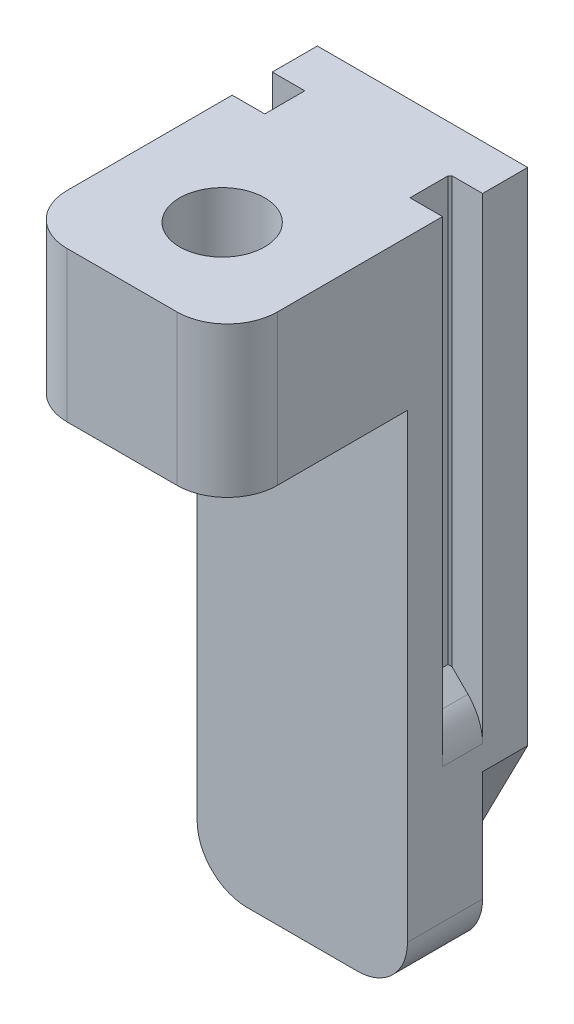
ISO-10303-21;
HEADER;
FILE_DESCRIPTION(('STEP AP214'),'2;1');
FILE_NAME('part.step','',(''),(''),'','','');
FILE_SCHEMA(('AUTOMOTIVE_DESIGN { 1 0 10303 214 1 1 1 1 }'));
ENDSEC;
DATA;
#1=APPLICATION_CONTEXT('core data for automotive mechanical design processes');
#2=APPLICATION_PROTOCOL_DEFINITION('international standard','automotive_design',2000,#1);
#3=PRODUCT_CONTEXT('',#1,'mechanical');
#4=PRODUCT('Part','Part','',(#3));
#5=PRODUCT_RELATED_PRODUCT_CATEGORY('part','',(#4));
#6=PRODUCT_DEFINITION_FORMATION('','',#4);
#7=PRODUCT_DEFINITION_CONTEXT('part definition',#1,'design');
#8=PRODUCT_DEFINITION('design','',#6,#7);
#9=PRODUCT_DEFINITION_SHAPE('','',#8);
#10=(LENGTH_UNIT() NAMED_UNIT(*) SI_UNIT(.MILLI.,.METRE.));
#11=(NAMED_UNIT(*) PLANE_ANGLE_UNIT() SI_UNIT($,.RADIAN.));
#12=(NAMED_UNIT(*) SI_UNIT($,.STERADIAN.) SOLID_ANGLE_UNIT());
#13=UNCERTAINTY_MEASURE_WITH_UNIT(LENGTH_MEASURE(1.E-05),#10,'distance_accuracy_value','');
#14=(GEOMETRIC_REPRESENTATION_CONTEXT(3) GLOBAL_UNCERTAINTY_ASSIGNED_CONTEXT((#13)) GLOBAL_UNIT_ASSIGNED_CONTEXT((#10,
#11,#12)) REPRESENTATION_CONTEXT('',''));
#15=CARTESIAN_POINT('',(0.,0.,0.));
#16=DIRECTION('',(0.,0.,1.));
#17=DIRECTION('',(1.,0.,0.));
#18=AXIS2_PLACEMENT_3D('',#15,#16,#17);
#19=CARTESIAN_POINT('',(-5.5,-50.,25.));
#20=DIRECTION('',(0.,1.,0.));
#21=DIRECTION('',(0.,0.,1.));
#22=AXIS2_PLACEMENT_3D('',#19,#20,#21);
#23=CYLINDRICAL_SURFACE('',#22,5.);
#24=CARTESIAN_POINT('',(-5.5,-15.,25.));
#25=DIRECTION('',(0.,-1.,0.));
#26=DIRECTION('',(0.,0.,-1.));
#27=AXIS2_PLACEMENT_3D('',#24,#25,#26);
#28=CIRCLE('',#27,5.);
#29=CARTESIAN_POINT('',(-5.5,-15.,30.));
#30=VERTEX_POINT('',#29);
#31=CARTESIAN_POINT('',(-10.5,-15.,25.));
#32=VERTEX_POINT('',#31);
#33=EDGE_CURVE('E195',#30,#32,#28,.T.);
#34=ORIENTED_EDGE('',*,*,#33,.F.);
#35=DIRECTION('',(0.,-1.,0.));
#36=VECTOR('',#35,1.);
#37=CARTESIAN_POINT('',(-5.5,-15.,30.));
#38=LINE('',#37,#36);
#39=CARTESIAN_POINT('',(-5.5,0.,30.));
#40=VERTEX_POINT('',#39);
#41=EDGE_CURVE('E27',#40,#30,#38,.T.);
#42=ORIENTED_EDGE('',*,*,#41,.F.);
#43=CARTESIAN_POINT('',(-5.5,0.,25.));
#44=DIRECTION('',(0.,1.,0.));
#45=DIRECTION('',(0.,0.,-1.));
#46=AXIS2_PLACEMENT_3D('',#43,#44,#45);
#47=CIRCLE('',#46,5.);
#48=CARTESIAN_POINT('',(-10.5,0.,25.));
#49=VERTEX_POINT('',#48);
#50=EDGE_CURVE('E768',#49,#40,#47,.T.);
#51=ORIENTED_EDGE('',*,*,#50,.F.);
#52=DIRECTION('',(0.,1.,0.));
#53=VECTOR('',#52,1.);
#54=CARTESIAN_POINT('',(-10.5,-50.,25.));
#55=LINE('',#54,#53);
#56=EDGE_CURVE('E353',#32,#49,#55,.T.);
#57=ORIENTED_EDGE('',*,*,#56,.F.);
#58=EDGE_LOOP('',(#34,#42,#51,#57));
#59=FACE_BOUND('',#58,.T.);
#60=ADVANCED_FACE('F19',(#59),#23,.T.);
#61=CARTESIAN_POINT('',(5.5,-15.,25.));
#62=DIRECTION('',(0.,1.,0.));
#63=DIRECTION('',(0.,0.,1.));
#64=AXIS2_PLACEMENT_3D('',#61,#62,#63);
#65=CYLINDRICAL_SURFACE('',#64,5.);
#66=CARTESIAN_POINT('',(5.5,-15.,25.));
#67=DIRECTION('',(0.,-1.,0.));
#68=DIRECTION('',(0.,0.,-1.));
#69=AXIS2_PLACEMENT_3D('',#66,#67,#68);
#70=CIRCLE('',#69,5.);
#71=CARTESIAN_POINT('',(10.5,-15.,25.));
#72=VERTEX_POINT('',#71);
#73=CARTESIAN_POINT('',(5.5,-15.,30.));
#74=VERTEX_POINT('',#73);
#75=EDGE_CURVE('E199',#72,#74,#70,.T.);
#76=ORIENTED_EDGE('',*,*,#75,.F.);
#77=DIRECTION('',(0.,-1.,0.));
#78=VECTOR('',#77,1.);
#79=CARTESIAN_POINT('',(10.5,-50.,25.));
#80=LINE('',#79,#78);
#81=CARTESIAN_POINT('',(10.5,0.,25.));
#82=VERTEX_POINT('',#81);
#83=EDGE_CURVE('E359',#82,#72,#80,.T.);
#84=ORIENTED_EDGE('',*,*,#83,.F.);
#85=CARTESIAN_POINT('',(5.5,0.,25.));
#86=DIRECTION('',(0.,1.,0.));
#87=DIRECTION('',(0.,0.,-1.));
#88=AXIS2_PLACEMENT_3D('',#85,#86,#87);
#89=CIRCLE('',#88,5.);
#90=CARTESIAN_POINT('',(5.5,0.,30.));
#91=VERTEX_POINT('',#90);
#92=EDGE_CURVE('E753',#91,#82,#89,.T.);
#93=ORIENTED_EDGE('',*,*,#92,.F.);
#94=DIRECTION('',(0.,1.,0.));
#95=VECTOR('',#94,1.);
#96=CARTESIAN_POINT('',(5.5,-15.,30.));
#97=LINE('',#96,#95);
#98=EDGE_CURVE('E12',#74,#91,#97,.T.);
#99=ORIENTED_EDGE('',*,*,#98,.F.);
#100=EDGE_LOOP('',(#76,#84,#93,#99));
#101=FACE_BOUND('',#100,.T.);
#102=ADVANCED_FACE('F914',(#101),#65,.T.);
#103=CARTESIAN_POINT('',(10.5,-15.,30.));
#104=DIRECTION('',(0.,0.,-1.));
#105=DIRECTION('',(0.,-1.,0.));
#106=AXIS2_PLACEMENT_3D('',#103,#104,#105);
#107=PLANE('',#106);
#108=DIRECTION('',(-1.,0.,0.));
#109=VECTOR('',#108,1.);
#110=CARTESIAN_POINT('',(10.5,0.,30.));
#111=LINE('',#110,#109);
#112=EDGE_CURVE('E762',#91,#40,#111,.T.);
#113=ORIENTED_EDGE('',*,*,#112,.T.);
#114=ORIENTED_EDGE('',*,*,#41,.T.);
#115=DIRECTION('',(-1.,0.,0.));
#116=VECTOR('',#115,1.);
#117=CARTESIAN_POINT('',(10.5,-15.,30.));
#118=LINE('',#117,#116);
#119=EDGE_CURVE('E200',#74,#30,#118,.T.);
#120=ORIENTED_EDGE('',*,*,#119,.F.);
#121=ORIENTED_EDGE('',*,*,#98,.T.);
#122=EDGE_LOOP('',(#113,#114,#120,#121));
#123=FACE_BOUND('',#122,.T.);
#124=ADVANCED_FACE('F953',(#123),#107,.F.);
#125=CARTESIAN_POINT('',(0.,-15.,20.));
#126=DIRECTION('',(0.,1.,0.));
#127=DIRECTION('',(0.,0.,1.));
#128=AXIS2_PLACEMENT_3D('',#125,#126,#127);
#129=CYLINDRICAL_SURFACE('',#128,4.25);
#130=CARTESIAN_POINT('',(0.,0.,20.));
#131=DIRECTION('',(0.,-1.,0.));
#132=DIRECTION('',(-1.,0.,0.));
#133=AXIS2_PLACEMENT_3D('',#130,#131,#132);
#134=CIRCLE('',#133,4.25);
#135=CARTESIAN_POINT('',(-4.25,0.,20.));
#136=VERTEX_POINT('',#135);
#137=EDGE_CURVE('E741',#136,#136,#134,.T.);
#138=ORIENTED_EDGE('',*,*,#137,.F.);
#139=EDGE_LOOP('',(#138));
#140=FACE_BOUND('',#139,.T.);
#141=CARTESIAN_POINT('',(0.,-15.,20.));
#142=DIRECTION('',(0.,-1.,0.));
#143=DIRECTION('',(-1.,0.,0.));
#144=AXIS2_PLACEMENT_3D('',#141,#142,#143);
#145=CIRCLE('',#144,4.25);
#146=CARTESIAN_POINT('',(-4.25,-15.,20.));
#147=VERTEX_POINT('',#146);
#148=EDGE_CURVE('E661',#147,#147,#145,.T.);
#149=ORIENTED_EDGE('',*,*,#148,.T.);
#150=EDGE_LOOP('',(#149));
#151=FACE_BOUND('',#150,.T.);
#152=ADVANCED_FACE('F996',(#140,#151),#129,.F.);
#153=CARTESIAN_POINT('',(0.,-15.,0.));
#154=DIRECTION('',(0.,-1.,0.));
#155=DIRECTION('',(0.,0.,-1.));
#156=AXIS2_PLACEMENT_3D('',#153,#154,#155);
#157=PLANE('',#156);
#158=ORIENTED_EDGE('',*,*,#119,.T.);
#159=ORIENTED_EDGE('',*,*,#33,.T.);
#160=DIRECTION('',(0.,0.,-1.));
#161=VECTOR('',#160,1.);
#162=CARTESIAN_POINT('',(-10.5,-15.,30.));
#163=LINE('',#162,#161);
#164=CARTESIAN_POINT('',(-10.5,-15.,12.));
#165=VERTEX_POINT('',#164);
#166=EDGE_CURVE('E273',#32,#165,#163,.T.);
#167=ORIENTED_EDGE('',*,*,#166,.T.);
#168=DIRECTION('',(-1.,0.,0.));
#169=VECTOR('',#168,1.);
#170=CARTESIAN_POINT('',(10.5,-15.,12.));
#171=LINE('',#170,#169);
#172=CARTESIAN_POINT('',(10.5,-15.,12.));
#173=VERTEX_POINT('',#172);
#174=EDGE_CURVE('E255',#173,#165,#171,.T.);
#175=ORIENTED_EDGE('',*,*,#174,.F.);
#176=DIRECTION('',(0.,0.,1.));
#177=VECTOR('',#176,1.);
#178=CARTESIAN_POINT('',(10.5,-15.,11.));
#179=LINE('',#178,#177);
#180=EDGE_CURVE('E363',#173,#72,#179,.T.);
#181=ORIENTED_EDGE('',*,*,#180,.T.);
#182=ORIENTED_EDGE('',*,*,#75,.T.);
#183=EDGE_LOOP('',(#158,#159,#167,#175,#181,#182));
#184=FACE_BOUND('',#183,.T.);
#185=ORIENTED_EDGE('',*,*,#148,.F.);
#186=EDGE_LOOP('',(#185));
#187=FACE_BOUND('',#186,.T.);
#188=ADVANCED_FACE('F957',(#184,#187),#157,.T.);
#189=CARTESIAN_POINT('',(5.5,-47.5710678118655,0.));
#190=DIRECTION('',(0.,0.,1.));
#191=DIRECTION('',(0.,-1.,0.));
#192=AXIS2_PLACEMENT_3D('',#189,#190,#191);
#193=CYLINDRICAL_SURFACE('',#192,5.);
#194=CARTESIAN_POINT('',(5.5,-47.5710678118655,4.5));
#195=DIRECTION('',(0.,0.,-1.));
#196=DIRECTION('',(-1.,0.,0.));
#197=AXIS2_PLACEMENT_3D('',#194,#195,#196);
#198=CIRCLE('',#197,5.);
#199=CARTESIAN_POINT('',(9.03553390593274,-44.0355339059327,4.5));
#200=VERTEX_POINT('',#199);
#201=CARTESIAN_POINT('',(10.5,-47.5710678118655,4.5));
#202=VERTEX_POINT('',#201);
#203=EDGE_CURVE('E294',#200,#202,#198,.T.);
#204=ORIENTED_EDGE('',*,*,#203,.F.);
#205=DIRECTION('',(0.,0.,-1.));
#206=VECTOR('',#205,1.);
#207=CARTESIAN_POINT('',(9.03553390593274,-44.0355339059327,12.));
#208=LINE('',#207,#206);
#209=CARTESIAN_POINT('',(9.03553390593274,-44.0355339059327,8.5));
#210=VERTEX_POINT('',#209);
#211=EDGE_CURVE('E669',#210,#200,#208,.T.);
#212=ORIENTED_EDGE('',*,*,#211,.F.);
#213=CARTESIAN_POINT('',(5.5,-47.5710678118655,8.5));
#214=DIRECTION('',(0.,0.,1.));
#215=DIRECTION('',(1.,0.,0.));
#216=AXIS2_PLACEMENT_3D('',#213,#214,#215);
#217=CIRCLE('',#216,5.);
#218=CARTESIAN_POINT('',(10.5,-47.5710678118655,8.5));
#219=VERTEX_POINT('',#218);
#220=EDGE_CURVE('E194',#219,#210,#217,.T.);
#221=ORIENTED_EDGE('',*,*,#220,.F.);
#222=DIRECTION('',(0.,0.,1.));
#223=VECTOR('',#222,1.);
#224=CARTESIAN_POINT('',(10.5,-47.5710678118655,0.));
#225=LINE('',#224,#223);
#226=EDGE_CURVE('E321',#202,#219,#225,.T.);
#227=ORIENTED_EDGE('',*,*,#226,.F.);
#228=EDGE_LOOP('',(#204,#212,#221,#227));
#229=FACE_BOUND('',#228,.T.);
#230=ADVANCED_FACE('F906',(#229),#193,.T.);
#231=CARTESIAN_POINT('',(-5.5,-47.5710678118655,12.));
#232=DIRECTION('',(0.,0.,-1.));
#233=DIRECTION('',(-1.,0.,0.));
#234=AXIS2_PLACEMENT_3D('',#231,#232,#233);
#235=CYLINDRICAL_SURFACE('',#234,5.);
#236=CARTESIAN_POINT('',(-5.5,-47.5710678118655,8.5));
#237=DIRECTION('',(0.,0.,1.));
#238=DIRECTION('',(1.,0.,0.));
#239=AXIS2_PLACEMENT_3D('',#236,#237,#238);
#240=CIRCLE('',#239,5.);
#241=CARTESIAN_POINT('',(-9.03553390593274,-44.0355339059327,8.5));
#242=VERTEX_POINT('',#241);
#243=CARTESIAN_POINT('',(-10.5,-47.5710678118655,8.5));
#244=VERTEX_POINT('',#243);
#245=EDGE_CURVE('E791',#242,#244,#240,.T.);
#246=ORIENTED_EDGE('',*,*,#245,.F.);
#247=DIRECTION('',(0.,0.,1.));
#248=VECTOR('',#247,1.);
#249=CARTESIAN_POINT('',(-9.03553390593274,-44.0355339059327,12.));
#250=LINE('',#249,#248);
#251=CARTESIAN_POINT('',(-9.03553390593273,-44.0355339059327,4.5));
#252=VERTEX_POINT('',#251);
#253=EDGE_CURVE('E137',#252,#242,#250,.T.);
#254=ORIENTED_EDGE('',*,*,#253,.F.);
#255=CARTESIAN_POINT('',(-5.5,-47.5710678118655,4.5));
#256=DIRECTION('',(0.,0.,-1.));
#257=DIRECTION('',(-1.,0.,0.));
#258=AXIS2_PLACEMENT_3D('',#255,#256,#257);
#259=CIRCLE('',#258,5.);
#260=CARTESIAN_POINT('',(-10.5,-47.5710678118655,4.5));
#261=VERTEX_POINT('',#260);
#262=EDGE_CURVE('E168',#261,#252,#259,.T.);
#263=ORIENTED_EDGE('',*,*,#262,.F.);
#264=DIRECTION('',(0.,0.,-1.));
#265=VECTOR('',#264,1.);
#266=CARTESIAN_POINT('',(-10.5,-47.5710678118655,12.));
#267=LINE('',#266,#265);
#268=EDGE_CURVE('E358',#244,#261,#267,.T.);
#269=ORIENTED_EDGE('',*,*,#268,.F.);
#270=EDGE_LOOP('',(#246,#254,#263,#269));
#271=FACE_BOUND('',#270,.T.);
#272=ADVANCED_FACE('F927',(#271),#235,.T.);
#273=CARTESIAN_POINT('',(15.,-50.,12.));
#274=DIRECTION('',(-0.707106781186548,-0.707106781186547,0.));
#275=DIRECTION('',(-0.707106781186547,0.707106781186548,0.));
#276=AXIS2_PLACEMENT_3D('',#273,#274,#275);
#277=PLANE('',#276);
#278=DIRECTION('',(-0.707106781186547,0.707106781186548,0.));
#279=VECTOR('',#278,1.);
#280=CARTESIAN_POINT('',(15.,-50.,8.5));
#281=LINE('',#280,#279);
#282=CARTESIAN_POINT('',(7.25,-42.25,8.5));
#283=VERTEX_POINT('',#282);
#284=EDGE_CURVE('E246',#210,#283,#281,.T.);
#285=ORIENTED_EDGE('',*,*,#284,.F.);
#286=ORIENTED_EDGE('',*,*,#211,.T.);
#287=DIRECTION('',(0.707106781186547,-0.707106781186548,0.));
#288=VECTOR('',#287,1.);
#289=CARTESIAN_POINT('',(15.,-50.,4.5));
#290=LINE('',#289,#288);
#291=CARTESIAN_POINT('',(7.45,-42.45,4.5));
#292=VERTEX_POINT('',#291);
#293=EDGE_CURVE('E291',#292,#200,#290,.T.);
#294=ORIENTED_EDGE('',*,*,#293,.F.);
#295=DIRECTION('',(0.577350269189626,-0.577350269189626,-0.577350269189626));
#296=VECTOR('',#295,1.);
#297=CARTESIAN_POINT('',(9.98333333333334,-44.9833333333333,1.96666666666666));
#298=LINE('',#297,#296);
#299=CARTESIAN_POINT('',(7.25,-42.25,4.7));
#300=VERTEX_POINT('',#299);
#301=EDGE_CURVE('E155',#300,#292,#298,.T.);
#302=ORIENTED_EDGE('',*,*,#301,.F.);
#303=DIRECTION('',(0.,0.,-1.));
#304=VECTOR('',#303,1.);
#305=CARTESIAN_POINT('',(7.25,-42.25,4.5));
#306=LINE('',#305,#304);
#307=EDGE_CURVE('E189',#283,#300,#306,.T.);
#308=ORIENTED_EDGE('',*,*,#307,.F.);
#309=EDGE_LOOP('',(#285,#286,#294,#302,#308));
#310=FACE_BOUND('',#309,.T.);
#311=ADVANCED_FACE('F478',(#310),#277,.F.);
#312=CARTESIAN_POINT('',(-15.,-50.,12.));
#313=DIRECTION('',(0.707106781186547,-0.707106781186548,0.));
#314=DIRECTION('',(0.,0.,-1.));
#315=AXIS2_PLACEMENT_3D('',#312,#313,#314);
#316=PLANE('',#315);
#317=DIRECTION('',(0.707106781186548,0.707106781186547,0.));
#318=VECTOR('',#317,1.);
#319=CARTESIAN_POINT('',(-15.,-50.,4.5));
#320=LINE('',#319,#318);
#321=CARTESIAN_POINT('',(-7.25,-42.25,4.5));
#322=VERTEX_POINT('',#321);
#323=EDGE_CURVE('E228',#252,#322,#320,.T.);
#324=ORIENTED_EDGE('',*,*,#323,.F.);
#325=ORIENTED_EDGE('',*,*,#253,.T.);
#326=DIRECTION('',(-0.707106781186548,-0.707106781186547,0.));
#327=VECTOR('',#326,1.);
#328=CARTESIAN_POINT('',(-15.,-50.,8.5));
#329=LINE('',#328,#327);
#330=CARTESIAN_POINT('',(-7.25,-42.25,8.5));
#331=VERTEX_POINT('',#330);
#332=EDGE_CURVE('E796',#331,#242,#329,.T.);
#333=ORIENTED_EDGE('',*,*,#332,.F.);
#334=DIRECTION('',(0.,0.,1.));
#335=VECTOR('',#334,1.);
#336=CARTESIAN_POINT('',(-7.25,-42.25,8.5));
#337=LINE('',#336,#335);
#338=EDGE_CURVE('E330',#322,#331,#337,.T.);
#339=ORIENTED_EDGE('',*,*,#338,.F.);
#340=EDGE_LOOP('',(#324,#325,#333,#339));
#341=FACE_BOUND('',#340,.T.);
#342=ADVANCED_FACE('F931',(#341),#316,.F.);
#343=CARTESIAN_POINT('',(-5.5,-61.,12.));
#344=DIRECTION('',(0.,0.,1.));
#345=DIRECTION('',(1.,0.,0.));
#346=AXIS2_PLACEMENT_3D('',#343,#344,#345);
#347=CYLINDRICAL_SURFACE('',#346,5.);
#348=CARTESIAN_POINT('',(-5.5,-61.,12.));
#349=DIRECTION('',(0.,0.,1.));
#350=DIRECTION('',(-1.,0.,0.));
#351=AXIS2_PLACEMENT_3D('',#348,#349,#350);
#352=CIRCLE('',#351,5.);
#353=CARTESIAN_POINT('',(-10.5,-61.,12.));
#354=VERTEX_POINT('',#353);
#355=CARTESIAN_POINT('',(-5.5,-66.,12.));
#356=VERTEX_POINT('',#355);
#357=EDGE_CURVE('E260',#354,#356,#352,.T.);
#358=ORIENTED_EDGE('',*,*,#357,.F.);
#359=DIRECTION('',(0.,0.,1.));
#360=VECTOR('',#359,1.);
#361=CARTESIAN_POINT('',(-10.5,-61.,12.));
#362=LINE('',#361,#360);
#363=CARTESIAN_POINT('',(-10.5,-61.,4.5));
#364=VERTEX_POINT('',#363);
#365=EDGE_CURVE('E811',#364,#354,#362,.T.);
#366=ORIENTED_EDGE('',*,*,#365,.F.);
#367=CARTESIAN_POINT('',(-5.5,-61.,4.5));
#368=DIRECTION('',(0.,0.,-1.));
#369=DIRECTION('',(-1.,0.,0.));
#370=AXIS2_PLACEMENT_3D('',#367,#368,#369);
#371=CIRCLE('',#370,5.);
#372=CARTESIAN_POINT('',(-5.5,-66.,4.5));
#373=VERTEX_POINT('',#372);
#374=EDGE_CURVE('E149',#373,#364,#371,.T.);
#375=ORIENTED_EDGE('',*,*,#374,.F.);
#376=DIRECTION('',(0.,0.,-1.));
#377=VECTOR('',#376,1.);
#378=CARTESIAN_POINT('',(-5.5,-66.,4.5));
#379=LINE('',#378,#377);
#380=EDGE_CURVE('E138',#356,#373,#379,.T.);
#381=ORIENTED_EDGE('',*,*,#380,.F.);
#382=EDGE_LOOP('',(#358,#366,#375,#381));
#383=FACE_BOUND('',#382,.T.);
#384=ADVANCED_FACE('F980',(#383),#347,.T.);
#385=CARTESIAN_POINT('',(5.5,-61.,8.5));
#386=DIRECTION('',(0.,0.,1.));
#387=DIRECTION('',(1.,0.,0.));
#388=AXIS2_PLACEMENT_3D('',#385,#386,#387);
#389=CYLINDRICAL_SURFACE('',#388,5.);
#390=CARTESIAN_POINT('',(5.5,-61.,12.));
#391=DIRECTION('',(0.,0.,1.));
#392=DIRECTION('',(-1.,0.,0.));
#393=AXIS2_PLACEMENT_3D('',#390,#391,#392);
#394=CIRCLE('',#393,5.);
#395=CARTESIAN_POINT('',(5.5,-66.,12.));
#396=VERTEX_POINT('',#395);
#397=CARTESIAN_POINT('',(10.5,-61.,12.));
#398=VERTEX_POINT('',#397);
#399=EDGE_CURVE('E131',#396,#398,#394,.T.);
#400=ORIENTED_EDGE('',*,*,#399,.F.);
#401=DIRECTION('',(0.,0.,1.));
#402=VECTOR('',#401,1.);
#403=CARTESIAN_POINT('',(5.5,-66.,12.));
#404=LINE('',#403,#402);
#405=CARTESIAN_POINT('',(5.5,-66.,4.5));
#406=VERTEX_POINT('',#405);
#407=EDGE_CURVE('E123',#406,#396,#404,.T.);
#408=ORIENTED_EDGE('',*,*,#407,.F.);
#409=CARTESIAN_POINT('',(5.5,-61.,4.5));
#410=DIRECTION('',(0.,0.,-1.));
#411=DIRECTION('',(-1.,0.,0.));
#412=AXIS2_PLACEMENT_3D('',#409,#410,#411);
#413=CIRCLE('',#412,5.);
#414=CARTESIAN_POINT('',(10.5,-61.,4.5));
#415=VERTEX_POINT('',#414);
#416=EDGE_CURVE('E128',#415,#406,#413,.T.);
#417=ORIENTED_EDGE('',*,*,#416,.F.);
#418=DIRECTION('',(0.,0.,-1.));
#419=VECTOR('',#418,1.);
#420=CARTESIAN_POINT('',(10.5,-61.,4.5));
#421=LINE('',#420,#419);
#422=EDGE_CURVE('E558',#398,#415,#421,.T.);
#423=ORIENTED_EDGE('',*,*,#422,.F.);
#424=EDGE_LOOP('',(#400,#408,#417,#423));
#425=FACE_BOUND('',#424,.T.);
#426=ADVANCED_FACE('F125',(#425),#389,.T.);
#427=CARTESIAN_POINT('',(10.5,-66.,12.));
#428=DIRECTION('',(0.,-1.,0.));
#429=DIRECTION('',(0.,0.,-1.));
#430=AXIS2_PLACEMENT_3D('',#427,#428,#429);
#431=PLANE('',#430);
#432=DIRECTION('',(-1.,0.,0.));
#433=VECTOR('',#432,1.);
#434=CARTESIAN_POINT('',(10.5,-66.,12.));
#435=LINE('',#434,#433);
#436=EDGE_CURVE('E264',#396,#356,#435,.T.);
#437=ORIENTED_EDGE('',*,*,#436,.T.);
#438=ORIENTED_EDGE('',*,*,#380,.T.);
#439=DIRECTION('',(-1.,0.,0.));
#440=VECTOR('',#439,1.);
#441=CARTESIAN_POINT('',(10.5,-66.,4.5));
#442=LINE('',#441,#440);
#443=EDGE_CURVE('E143',#406,#373,#442,.T.);
#444=ORIENTED_EDGE('',*,*,#443,.F.);
#445=ORIENTED_EDGE('',*,*,#407,.T.);
#446=EDGE_LOOP('',(#437,#438,#444,#445));
#447=FACE_BOUND('',#446,.T.);
#448=ADVANCED_FACE('F151',(#447),#431,.T.);
#449=CARTESIAN_POINT('',(0.,0.,4.5));
#450=DIRECTION('',(0.,0.,-1.));
#451=DIRECTION('',(0.,-1.,0.));
#452=AXIS2_PLACEMENT_3D('',#449,#450,#451);
#453=PLANE('',#452);
#454=ORIENTED_EDGE('',*,*,#443,.T.);
#455=ORIENTED_EDGE('',*,*,#374,.T.);
#456=DIRECTION('',(0.,1.,0.));
#457=VECTOR('',#456,1.);
#458=CARTESIAN_POINT('',(-10.5,-66.,4.5));
#459=LINE('',#458,#457);
#460=CARTESIAN_POINT('',(-10.5,-50.,4.5));
#461=VERTEX_POINT('',#460);
#462=EDGE_CURVE('E817',#364,#461,#459,.T.);
#463=ORIENTED_EDGE('',*,*,#462,.T.);
#464=DIRECTION('',(0.457310412755125,-0.88930713838681,0.));
#465=VECTOR('',#464,1.);
#466=CARTESIAN_POINT('',(-10.5,-50.,4.5));
#467=LINE('',#466,#465);
#468=CARTESIAN_POINT('',(-3.42383248278889,-63.7606450891079,4.5));
#469=VERTEX_POINT('',#468);
#470=EDGE_CURVE('E727',#461,#469,#467,.T.);
#471=ORIENTED_EDGE('',*,*,#470,.T.);
#472=CARTESIAN_POINT('',(0.,-62.,4.5));
#473=DIRECTION('',(0.,0.,1.));
#474=DIRECTION('',(1.,0.,0.));
#475=AXIS2_PLACEMENT_3D('',#472,#473,#474);
#476=CIRCLE('',#475,3.85);
#477=CARTESIAN_POINT('',(3.42383248278888,-63.7606450891079,4.5));
#478=VERTEX_POINT('',#477);
#479=EDGE_CURVE('E714',#469,#478,#476,.T.);
#480=ORIENTED_EDGE('',*,*,#479,.T.);
#481=DIRECTION('',(0.457310412755124,0.889307138386811,0.));
#482=VECTOR('',#481,1.);
#483=CARTESIAN_POINT('',(10.5,-50.,4.5));
#484=LINE('',#483,#482);
#485=CARTESIAN_POINT('',(10.5,-50.,4.5));
#486=VERTEX_POINT('',#485);
#487=EDGE_CURVE('E163',#478,#486,#484,.T.);
#488=ORIENTED_EDGE('',*,*,#487,.T.);
#489=DIRECTION('',(0.,-1.,0.));
#490=VECTOR('',#489,1.);
#491=CARTESIAN_POINT('',(10.5,-50.,4.5));
#492=LINE('',#491,#490);
#493=EDGE_CURVE('E146',#486,#415,#492,.T.);
#494=ORIENTED_EDGE('',*,*,#493,.T.);
#495=ORIENTED_EDGE('',*,*,#416,.T.);
#496=EDGE_LOOP('',(#454,#455,#463,#471,#480,#488,#494,#495));
#497=FACE_BOUND('',#496,.T.);
#498=ADVANCED_FACE('F142',(#497),#453,.T.);
#499=CARTESIAN_POINT('',(7.25,-50.,4.7));
#500=DIRECTION('',(0.707106781186548,0.,0.707106781186548));
#501=DIRECTION('',(0.,-1.,0.));
#502=AXIS2_PLACEMENT_3D('',#499,#500,#501);
#503=PLANE('',#502);
#504=DIRECTION('',(0.,1.,0.));
#505=VECTOR('',#504,1.);
#506=CARTESIAN_POINT('',(7.25,0.,4.7));
#507=LINE('',#506,#505);
#508=CARTESIAN_POINT('',(7.25,0.,4.7));
#509=VERTEX_POINT('',#508);
#510=EDGE_CURVE('E182',#300,#509,#507,.T.);
#511=ORIENTED_EDGE('',*,*,#510,.F.);
#512=ORIENTED_EDGE('',*,*,#301,.T.);
#513=DIRECTION('',(0.,-1.,0.));
#514=VECTOR('',#513,1.);
#515=CARTESIAN_POINT('',(7.45,-50.,4.5));
#516=LINE('',#515,#514);
#517=CARTESIAN_POINT('',(7.45,0.,4.5));
#518=VERTEX_POINT('',#517);
#519=EDGE_CURVE('E286',#518,#292,#516,.T.);
#520=ORIENTED_EDGE('',*,*,#519,.F.);
#521=DIRECTION('',(0.707106781186548,0.,-0.707106781186548));
#522=VECTOR('',#521,1.);
#523=CARTESIAN_POINT('',(5.975,0.,5.975));
#524=LINE('',#523,#522);
#525=EDGE_CURVE('E484',#509,#518,#524,.T.);
#526=ORIENTED_EDGE('',*,*,#525,.F.);
#527=EDGE_LOOP('',(#511,#512,#520,#526));
#528=FACE_BOUND('',#527,.T.);
#529=ADVANCED_FACE('F483',(#528),#503,.T.);
#530=CARTESIAN_POINT('',(10.5,-50.,4.5));
#531=DIRECTION('',(-0.889307138386811,0.457310412755124,0.));
#532=DIRECTION('',(0.,0.,1.));
#533=AXIS2_PLACEMENT_3D('',#530,#531,#532);
#534=PLANE('',#533);
#535=DIRECTION('',(0.457310412755124,0.889307138386811,0.));
#536=VECTOR('',#535,1.);
#537=CARTESIAN_POINT('',(10.5,-50.,0.));
#538=LINE('',#537,#536);
#539=CARTESIAN_POINT('',(3.42383248278888,-63.7606450891079,0.));
#540=VERTEX_POINT('',#539);
#541=CARTESIAN_POINT('',(10.5,-50.,0.));
#542=VERTEX_POINT('',#541);
#543=EDGE_CURVE('E315',#540,#542,#538,.T.);
#544=ORIENTED_EDGE('',*,*,#543,.T.);
#545=DIRECTION('',(0.,0.,1.));
#546=VECTOR('',#545,1.);
#547=CARTESIAN_POINT('',(10.5,-50.,0.));
#548=LINE('',#547,#546);
#549=EDGE_CURVE('E542',#542,#486,#548,.T.);
#550=ORIENTED_EDGE('',*,*,#549,.T.);
#551=ORIENTED_EDGE('',*,*,#487,.F.);
#552=DIRECTION('',(0.,0.,-1.));
#553=VECTOR('',#552,1.);
#554=CARTESIAN_POINT('',(3.42383248278888,-63.7606450891079,4.5));
#555=LINE('',#554,#553);
#556=EDGE_CURVE('E721',#478,#540,#555,.T.);
#557=ORIENTED_EDGE('',*,*,#556,.T.);
#558=EDGE_LOOP('',(#544,#550,#551,#557));
#559=FACE_BOUND('',#558,.T.);
#560=ADVANCED_FACE('F966',(#559),#534,.F.);
#561=CARTESIAN_POINT('',(0.,-62.,4.5));
#562=DIRECTION('',(0.,0.,-1.));
#563=DIRECTION('',(-1.,0.,0.));
#564=AXIS2_PLACEMENT_3D('',#561,#562,#563);
#565=CYLINDRICAL_SURFACE('',#564,3.85);
#566=CARTESIAN_POINT('',(0.,-62.,0.));
#567=DIRECTION('',(0.,0.,1.));
#568=DIRECTION('',(1.,0.,0.));
#569=AXIS2_PLACEMENT_3D('',#566,#567,#568);
#570=CIRCLE('',#569,3.85);
#571=CARTESIAN_POINT('',(-3.42383248278889,-63.7606450891079,0.));
#572=VERTEX_POINT('',#571);
#573=EDGE_CURVE('E320',#572,#540,#570,.T.);
#574=ORIENTED_EDGE('',*,*,#573,.T.);
#575=ORIENTED_EDGE('',*,*,#556,.F.);
#576=ORIENTED_EDGE('',*,*,#479,.F.);
#577=DIRECTION('',(0.,0.,-1.));
#578=VECTOR('',#577,1.);
#579=CARTESIAN_POINT('',(-3.42383248278889,-63.7606450891079,4.5));
#580=LINE('',#579,#578);
#581=EDGE_CURVE('E735',#469,#572,#580,.T.);
#582=ORIENTED_EDGE('',*,*,#581,.T.);
#583=EDGE_LOOP('',(#574,#575,#576,#582));
#584=FACE_BOUND('',#583,.T.);
#585=ADVANCED_FACE('F1073',(#584),#565,.T.);
#586=CARTESIAN_POINT('',(-10.5,-50.,4.5));
#587=DIRECTION('',(0.88930713838681,0.457310412755125,0.));
#588=DIRECTION('',(0.,0.,-1.));
#589=AXIS2_PLACEMENT_3D('',#586,#587,#588);
#590=PLANE('',#589);
#591=DIRECTION('',(0.457310412755125,-0.88930713838681,0.));
#592=VECTOR('',#591,1.);
#593=CARTESIAN_POINT('',(-10.5,-50.,0.));
#594=LINE('',#593,#592);
#595=CARTESIAN_POINT('',(-10.5,-50.,0.));
#596=VERTEX_POINT('',#595);
#597=EDGE_CURVE('E329',#596,#572,#594,.T.);
#598=ORIENTED_EDGE('',*,*,#597,.T.);
#599=ORIENTED_EDGE('',*,*,#581,.F.);
#600=ORIENTED_EDGE('',*,*,#470,.F.);
#601=DIRECTION('',(0.,0.,-1.));
#602=VECTOR('',#601,1.);
#603=CARTESIAN_POINT('',(-10.5,-50.,4.5));
#604=LINE('',#603,#602);
#605=EDGE_CURVE('E357',#461,#596,#604,.T.);
#606=ORIENTED_EDGE('',*,*,#605,.T.);
#607=EDGE_LOOP('',(#598,#599,#600,#606));
#608=FACE_BOUND('',#607,.T.);
#609=ADVANCED_FACE('F944',(#608),#590,.F.);
#610=CARTESIAN_POINT('',(0.,0.,0.));
#611=DIRECTION('',(0.,-1.,0.));
#612=DIRECTION('',(0.,0.,-1.));
#613=AXIS2_PLACEMENT_3D('',#610,#611,#612);
#614=PLANE('',#613);
#615=ORIENTED_EDGE('',*,*,#137,.T.);
#616=EDGE_LOOP('',(#615));
#617=FACE_BOUND('',#616,.T.);
#618=DIRECTION('',(0.,0.,-1.));
#619=VECTOR('',#618,1.);
#620=CARTESIAN_POINT('',(-10.5,0.,12.));
#621=LINE('',#620,#619);
#622=CARTESIAN_POINT('',(-10.5,0.,8.5));
#623=VERTEX_POINT('',#622);
#624=EDGE_CURVE('E347',#49,#623,#621,.T.);
#625=ORIENTED_EDGE('',*,*,#624,.F.);
#626=ORIENTED_EDGE('',*,*,#50,.T.);
#627=ORIENTED_EDGE('',*,*,#112,.F.);
#628=ORIENTED_EDGE('',*,*,#92,.T.);
#629=DIRECTION('',(0.,0.,1.));
#630=VECTOR('',#629,1.);
#631=CARTESIAN_POINT('',(10.5,0.,8.5));
#632=LINE('',#631,#630);
#633=CARTESIAN_POINT('',(10.5,0.,8.5));
#634=VERTEX_POINT('',#633);
#635=EDGE_CURVE('E213',#634,#82,#632,.T.);
#636=ORIENTED_EDGE('',*,*,#635,.F.);
#637=DIRECTION('',(1.,0.,0.));
#638=VECTOR('',#637,1.);
#639=CARTESIAN_POINT('',(7.25,0.,8.5));
#640=LINE('',#639,#638);
#641=CARTESIAN_POINT('',(7.25,0.,8.5));
#642=VERTEX_POINT('',#641);
#643=EDGE_CURVE('E251',#642,#634,#640,.T.);
#644=ORIENTED_EDGE('',*,*,#643,.F.);
#645=DIRECTION('',(0.,0.,1.));
#646=VECTOR('',#645,1.);
#647=CARTESIAN_POINT('',(7.25,0.,4.5));
#648=LINE('',#647,#646);
#649=EDGE_CURVE('E188',#509,#642,#648,.T.);
#650=ORIENTED_EDGE('',*,*,#649,.F.);
#651=ORIENTED_EDGE('',*,*,#525,.T.);
#652=DIRECTION('',(-1.,0.,0.));
#653=VECTOR('',#652,1.);
#654=CARTESIAN_POINT('',(10.5,0.,4.5));
#655=LINE('',#654,#653);
#656=CARTESIAN_POINT('',(10.5,0.,4.5));
#657=VERTEX_POINT('',#656);
#658=EDGE_CURVE('E274',#657,#518,#655,.T.);
#659=ORIENTED_EDGE('',*,*,#658,.F.);
#660=DIRECTION('',(0.,0.,1.));
#661=VECTOR('',#660,1.);
#662=CARTESIAN_POINT('',(10.5,0.,0.));
#663=LINE('',#662,#661);
#664=CARTESIAN_POINT('',(10.5,0.,0.));
#665=VERTEX_POINT('',#664);
#666=EDGE_CURVE('E534',#665,#657,#663,.T.);
#667=ORIENTED_EDGE('',*,*,#666,.F.);
#668=DIRECTION('',(1.,0.,0.));
#669=VECTOR('',#668,1.);
#670=CARTESIAN_POINT('',(-10.5,0.,0.));
#671=LINE('',#670,#669);
#672=CARTESIAN_POINT('',(-10.5,0.,0.));
#673=VERTEX_POINT('',#672);
#674=EDGE_CURVE('E364',#673,#665,#671,.T.);
#675=ORIENTED_EDGE('',*,*,#674,.F.);
#676=DIRECTION('',(0.,0.,-1.));
#677=VECTOR('',#676,1.);
#678=CARTESIAN_POINT('',(-10.5,0.,4.5));
#679=LINE('',#678,#677);
#680=CARTESIAN_POINT('',(-10.5,0.,4.5));
#681=VERTEX_POINT('',#680);
#682=EDGE_CURVE('E354',#681,#673,#679,.T.);
#683=ORIENTED_EDGE('',*,*,#682,.F.);
#684=DIRECTION('',(-1.,0.,0.));
#685=VECTOR('',#684,1.);
#686=CARTESIAN_POINT('',(-7.25,0.,4.5));
#687=LINE('',#686,#685);
#688=CARTESIAN_POINT('',(-7.25,0.,4.5));
#689=VERTEX_POINT('',#688);
#690=EDGE_CURVE('E240',#689,#681,#687,.T.);
#691=ORIENTED_EDGE('',*,*,#690,.F.);
#692=DIRECTION('',(0.,0.,-1.));
#693=VECTOR('',#692,1.);
#694=CARTESIAN_POINT('',(-7.25,0.,8.5));
#695=LINE('',#694,#693);
#696=CARTESIAN_POINT('',(-7.25,0.,8.5));
#697=VERTEX_POINT('',#696);
#698=EDGE_CURVE('E333',#697,#689,#695,.T.);
#699=ORIENTED_EDGE('',*,*,#698,.F.);
#700=DIRECTION('',(1.,0.,0.));
#701=VECTOR('',#700,1.);
#702=CARTESIAN_POINT('',(-10.5,0.,8.5));
#703=LINE('',#702,#701);
#704=EDGE_CURVE('E293',#623,#697,#703,.T.);
#705=ORIENTED_EDGE('',*,*,#704,.F.);
#706=EDGE_LOOP('',(#625,#626,#627,#628,#636,#644,#650,#651,#659,#667,#675,#683,#691,#699,#705));
#707=FACE_BOUND('',#706,.T.);
#708=ADVANCED_FACE('F381',(#617,#707),#614,.F.);
#709=CARTESIAN_POINT('',(-7.25,-50.,8.5));
#710=DIRECTION('',(1.,0.,0.));
#711=DIRECTION('',(0.,0.,1.));
#712=AXIS2_PLACEMENT_3D('',#709,#710,#711);
#713=PLANE('',#712);
#714=DIRECTION('',(0.,1.,0.));
#715=VECTOR('',#714,1.);
#716=CARTESIAN_POINT('',(-7.25,-50.,4.5));
#717=LINE('',#716,#715);
#718=EDGE_CURVE('E170',#322,#689,#717,.T.);
#719=ORIENTED_EDGE('',*,*,#718,.F.);
#720=ORIENTED_EDGE('',*,*,#338,.T.);
#721=DIRECTION('',(0.,1.,0.));
#722=VECTOR('',#721,1.);
#723=CARTESIAN_POINT('',(-7.25,-50.,8.5));
#724=LINE('',#723,#722);
#725=EDGE_CURVE('E803',#331,#697,#724,.T.);
#726=ORIENTED_EDGE('',*,*,#725,.T.);
#727=ORIENTED_EDGE('',*,*,#698,.T.);
#728=EDGE_LOOP('',(#719,#720,#726,#727));
#729=FACE_BOUND('',#728,.T.);
#730=ADVANCED_FACE('F933',(#729),#713,.F.);
#731=CARTESIAN_POINT('',(-10.5,-50.,8.5));
#732=DIRECTION('',(0.,0.,1.));
#733=DIRECTION('',(1.,0.,0.));
#734=AXIS2_PLACEMENT_3D('',#731,#732,#733);
#735=PLANE('',#734);
#736=ORIENTED_EDGE('',*,*,#725,.F.);
#737=ORIENTED_EDGE('',*,*,#332,.T.);
#738=ORIENTED_EDGE('',*,*,#245,.T.);
#739=DIRECTION('',(0.,1.,0.));
#740=VECTOR('',#739,1.);
#741=CARTESIAN_POINT('',(-10.5,-50.,8.5));
#742=LINE('',#741,#740);
#743=EDGE_CURVE('E352',#244,#623,#742,.T.);
#744=ORIENTED_EDGE('',*,*,#743,.T.);
#745=ORIENTED_EDGE('',*,*,#704,.T.);
#746=EDGE_LOOP('',(#736,#737,#738,#744,#745));
#747=FACE_BOUND('',#746,.T.);
#748=ADVANCED_FACE('F935',(#747),#735,.F.);
#749=CARTESIAN_POINT('',(-10.5,-50.,12.));
#750=DIRECTION('',(1.,0.,0.));
#751=DIRECTION('',(0.,0.,1.));
#752=AXIS2_PLACEMENT_3D('',#749,#750,#751);
#753=PLANE('',#752);
#754=ORIENTED_EDGE('',*,*,#166,.F.);
#755=ORIENTED_EDGE('',*,*,#56,.T.);
#756=ORIENTED_EDGE('',*,*,#624,.T.);
#757=ORIENTED_EDGE('',*,*,#743,.F.);
#758=ORIENTED_EDGE('',*,*,#268,.T.);
#759=DIRECTION('',(0.,1.,0.));
#760=VECTOR('',#759,1.);
#761=CARTESIAN_POINT('',(-10.5,-50.,4.5));
#762=LINE('',#761,#760);
#763=EDGE_CURVE('E216',#261,#681,#762,.T.);
#764=ORIENTED_EDGE('',*,*,#763,.T.);
#765=ORIENTED_EDGE('',*,*,#682,.T.);
#766=DIRECTION('',(0.,1.,0.));
#767=VECTOR('',#766,1.);
#768=CARTESIAN_POINT('',(-10.5,-50.,0.));
#769=LINE('',#768,#767);
#770=EDGE_CURVE('E341',#596,#673,#769,.T.);
#771=ORIENTED_EDGE('',*,*,#770,.F.);
#772=ORIENTED_EDGE('',*,*,#605,.F.);
#773=ORIENTED_EDGE('',*,*,#462,.F.);
#774=ORIENTED_EDGE('',*,*,#365,.T.);
#775=DIRECTION('',(0.,1.,0.));
#776=VECTOR('',#775,1.);
#777=CARTESIAN_POINT('',(-10.5,-50.,12.));
#778=LINE('',#777,#776);
#779=EDGE_CURVE('E256',#354,#165,#778,.T.);
#780=ORIENTED_EDGE('',*,*,#779,.T.);
#781=EDGE_LOOP('',(#754,#755,#756,#757,#758,#764,#765,#771,#772,#773,#774,#780));
#782=FACE_BOUND('',#781,.T.);
#783=ADVANCED_FACE('F941',(#782),#753,.F.);
#784=CARTESIAN_POINT('',(10.5,-50.,12.));
#785=DIRECTION('',(0.,0.,-1.));
#786=DIRECTION('',(0.,-1.,0.));
#787=AXIS2_PLACEMENT_3D('',#784,#785,#786);
#788=PLANE('',#787);
#789=DIRECTION('',(0.,1.,0.));
#790=VECTOR('',#789,1.);
#791=CARTESIAN_POINT('',(10.5,-50.,12.));
#792=LINE('',#791,#790);
#793=EDGE_CURVE('E566',#398,#173,#792,.T.);
#794=ORIENTED_EDGE('',*,*,#793,.T.);
#795=ORIENTED_EDGE('',*,*,#174,.T.);
#796=ORIENTED_EDGE('',*,*,#779,.F.);
#797=ORIENTED_EDGE('',*,*,#357,.T.);
#798=ORIENTED_EDGE('',*,*,#436,.F.);
#799=ORIENTED_EDGE('',*,*,#399,.T.);
#800=EDGE_LOOP('',(#794,#795,#796,#797,#798,#799));
#801=FACE_BOUND('',#800,.T.);
#802=ADVANCED_FACE('F962',(#801),#788,.F.);
#803=CARTESIAN_POINT('',(7.25,-50.,8.5));
#804=DIRECTION('',(0.,0.,1.));
#805=DIRECTION('',(1.,0.,0.));
#806=AXIS2_PLACEMENT_3D('',#803,#804,#805);
#807=PLANE('',#806);
#808=DIRECTION('',(0.,1.,0.));
#809=VECTOR('',#808,1.);
#810=CARTESIAN_POINT('',(10.5,-50.,8.5));
#811=LINE('',#810,#809);
#812=EDGE_CURVE('E292',#219,#634,#811,.T.);
#813=ORIENTED_EDGE('',*,*,#812,.F.);
#814=ORIENTED_EDGE('',*,*,#220,.T.);
#815=ORIENTED_EDGE('',*,*,#284,.T.);
#816=DIRECTION('',(0.,1.,0.));
#817=VECTOR('',#816,1.);
#818=CARTESIAN_POINT('',(7.25,-50.,8.5));
#819=LINE('',#818,#817);
#820=EDGE_CURVE('E275',#283,#642,#819,.T.);
#821=ORIENTED_EDGE('',*,*,#820,.T.);
#822=ORIENTED_EDGE('',*,*,#643,.T.);
#823=EDGE_LOOP('',(#813,#814,#815,#821,#822));
#824=FACE_BOUND('',#823,.T.);
#825=ADVANCED_FACE('F901',(#824),#807,.F.);
#826=CARTESIAN_POINT('',(7.25,-50.,4.5));
#827=DIRECTION('',(-1.,0.,0.));
#828=DIRECTION('',(0.,1.,0.));
#829=AXIS2_PLACEMENT_3D('',#826,#827,#828);
#830=PLANE('',#829);
#831=ORIENTED_EDGE('',*,*,#820,.F.);
#832=ORIENTED_EDGE('',*,*,#307,.T.);
#833=ORIENTED_EDGE('',*,*,#510,.T.);
#834=ORIENTED_EDGE('',*,*,#649,.T.);
#835=EDGE_LOOP('',(#831,#832,#833,#834));
#836=FACE_BOUND('',#835,.T.);
#837=ADVANCED_FACE('F486',(#836),#830,.F.);
#838=CARTESIAN_POINT('',(10.5,-50.,4.5));
#839=DIRECTION('',(0.,0.,-1.));
#840=DIRECTION('',(-1.,0.,0.));
#841=AXIS2_PLACEMENT_3D('',#838,#839,#840);
#842=PLANE('',#841);
#843=ORIENTED_EDGE('',*,*,#519,.T.);
#844=ORIENTED_EDGE('',*,*,#293,.T.);
#845=ORIENTED_EDGE('',*,*,#203,.T.);
#846=DIRECTION('',(0.,1.,0.));
#847=VECTOR('',#846,1.);
#848=CARTESIAN_POINT('',(10.5,-50.,4.5));
#849=LINE('',#848,#847);
#850=EDGE_CURVE('E324',#202,#657,#849,.T.);
#851=ORIENTED_EDGE('',*,*,#850,.T.);
#852=ORIENTED_EDGE('',*,*,#658,.T.);
#853=EDGE_LOOP('',(#843,#844,#845,#851,#852));
#854=FACE_BOUND('',#853,.T.);
#855=ADVANCED_FACE('F910',(#854),#842,.F.);
#856=CARTESIAN_POINT('',(10.5,-50.,0.));
#857=DIRECTION('',(-1.,0.,0.));
#858=DIRECTION('',(0.,0.,1.));
#859=AXIS2_PLACEMENT_3D('',#856,#857,#858);
#860=PLANE('',#859);
#861=ORIENTED_EDGE('',*,*,#635,.T.);
#862=ORIENTED_EDGE('',*,*,#83,.T.);
#863=ORIENTED_EDGE('',*,*,#180,.F.);
#864=ORIENTED_EDGE('',*,*,#793,.F.);
#865=ORIENTED_EDGE('',*,*,#422,.T.);
#866=ORIENTED_EDGE('',*,*,#493,.F.);
#867=ORIENTED_EDGE('',*,*,#549,.F.);
#868=DIRECTION('',(0.,1.,0.));
#869=VECTOR('',#868,1.);
#870=CARTESIAN_POINT('',(10.5,-50.,0.));
#871=LINE('',#870,#869);
#872=EDGE_CURVE('E313',#542,#665,#871,.T.);
#873=ORIENTED_EDGE('',*,*,#872,.T.);
#874=ORIENTED_EDGE('',*,*,#666,.T.);
#875=ORIENTED_EDGE('',*,*,#850,.F.);
#876=ORIENTED_EDGE('',*,*,#226,.T.);
#877=ORIENTED_EDGE('',*,*,#812,.T.);
#878=EDGE_LOOP('',(#861,#862,#863,#864,#865,#866,#867,#873,#874,#875,#876,#877));
#879=FACE_BOUND('',#878,.T.);
#880=ADVANCED_FACE('F909',(#879),#860,.F.);
#881=CARTESIAN_POINT('',(-10.5,-50.,0.));
#882=DIRECTION('',(0.,0.,1.));
#883=DIRECTION('',(1.,0.,0.));
#884=AXIS2_PLACEMENT_3D('',#881,#882,#883);
#885=PLANE('',#884);
#886=ORIENTED_EDGE('',*,*,#674,.T.);
#887=ORIENTED_EDGE('',*,*,#872,.F.);
#888=ORIENTED_EDGE('',*,*,#543,.F.);
#889=ORIENTED_EDGE('',*,*,#573,.F.);
#890=ORIENTED_EDGE('',*,*,#597,.F.);
#891=ORIENTED_EDGE('',*,*,#770,.T.);
#892=EDGE_LOOP('',(#886,#887,#888,#889,#890,#891));
#893=FACE_BOUND('',#892,.T.);
#894=ADVANCED_FACE('F970',(#893),#885,.F.);
#895=CARTESIAN_POINT('',(10.5,-50.,4.5));
#896=DIRECTION('',(0.,0.,-1.));
#897=DIRECTION('',(-1.,0.,0.));
#898=AXIS2_PLACEMENT_3D('',#895,#896,#897);
#899=PLANE('',#898);
#900=ORIENTED_EDGE('',*,*,#763,.F.);
#901=ORIENTED_EDGE('',*,*,#262,.T.);
#902=ORIENTED_EDGE('',*,*,#323,.T.);
#903=ORIENTED_EDGE('',*,*,#718,.T.);
#904=ORIENTED_EDGE('',*,*,#690,.T.);
#905=EDGE_LOOP('',(#900,#901,#902,#903,#904));
#906=FACE_BOUND('',#905,.T.);
#907=ADVANCED_FACE('F372',(#906),#899,.F.);
#908=CLOSED_SHELL('',(#60,#102,#124,#152,#188,#230,#272,#311,#342,#384,#426,#448,#498,#529,#560,
#585,#609,#708,#730,#748,#783,#802,#825,#837,#855,#880,#894,#907));
#909=MANIFOLD_SOLID_BREP('B1',#908);
#910=ADVANCED_BREP_SHAPE_REPRESENTATION('',(#18,#909),#14);
#911=SHAPE_DEFINITION_REPRESENTATION(#9,#910);
ENDSEC;
END-ISO-10303-21;
